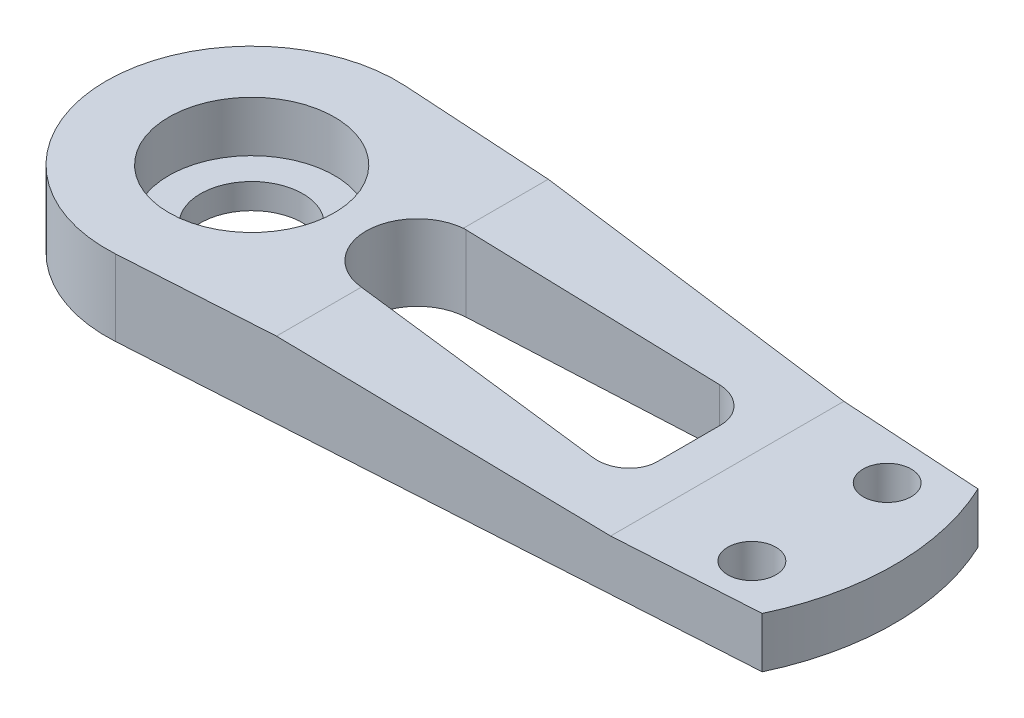
ISO-10303-21;
HEADER;
FILE_DESCRIPTION(('STEP AP214'),'2;1');
FILE_NAME('part.step','',(''),(''),'','','');
FILE_SCHEMA(('AUTOMOTIVE_DESIGN { 1 0 10303 214 1 1 1 1 }'));
ENDSEC;
DATA;
#1=APPLICATION_CONTEXT('core data for automotive mechanical design processes');
#2=APPLICATION_PROTOCOL_DEFINITION('international standard','automotive_design',2000,#1);
#3=PRODUCT_CONTEXT('',#1,'mechanical');
#4=PRODUCT('Part','Part','',(#3));
#5=PRODUCT_RELATED_PRODUCT_CATEGORY('part','',(#4));
#6=PRODUCT_DEFINITION_FORMATION('','',#4);
#7=PRODUCT_DEFINITION_CONTEXT('part definition',#1,'design');
#8=PRODUCT_DEFINITION('design','',#6,#7);
#9=PRODUCT_DEFINITION_SHAPE('','',#8);
#10=(LENGTH_UNIT() NAMED_UNIT(*) SI_UNIT(.MILLI.,.METRE.));
#11=(NAMED_UNIT(*) PLANE_ANGLE_UNIT() SI_UNIT($,.RADIAN.));
#12=(NAMED_UNIT(*) SI_UNIT($,.STERADIAN.) SOLID_ANGLE_UNIT());
#13=UNCERTAINTY_MEASURE_WITH_UNIT(LENGTH_MEASURE(1.E-05),#10,'distance_accuracy_value','');
#14=(GEOMETRIC_REPRESENTATION_CONTEXT(3) GLOBAL_UNCERTAINTY_ASSIGNED_CONTEXT((#13)) GLOBAL_UNIT_ASSIGNED_CONTEXT((#10,
#11,#12)) REPRESENTATION_CONTEXT('',''));
#15=CARTESIAN_POINT('',(0.,0.,0.));
#16=DIRECTION('',(0.,0.,1.));
#17=DIRECTION('',(1.,0.,0.));
#18=AXIS2_PLACEMENT_3D('',#15,#16,#17);
#19=CARTESIAN_POINT('',(0.702058204650816,6.,11.4785501818515));
#20=DIRECTION('',(-0.0610485395348535,0.,-0.998134798421867));
#21=DIRECTION('',(-0.998134798421867,0.,0.0610485395348535));
#22=AXIS2_PLACEMENT_3D('',#19,#20,#21);
#23=PLANE('',#22);
#24=DIRECTION('',(0.994941281323273,-0.0799295493697137,-0.0608532156616081));
#25=VECTOR('',#24,1.);
#26=CARTESIAN_POINT('',(0.778760734044066,6.95834388975943,11.4738588541816));
#27=LINE('',#26,#25);
#28=CARTESIAN_POINT('',(12.7079647035946,6.,10.7442374830944));
#29=VERTEX_POINT('',#28);
#30=CARTESIAN_POINT('',(37.6034204935723,4.,9.2215661771389));
#31=VERTEX_POINT('',#30);
#32=EDGE_CURVE('E285',#29,#31,#27,.T.);
#33=ORIENTED_EDGE('',*,*,#32,.F.);
#34=DIRECTION('',(0.998134798421867,0.,-0.0610485395348535));
#35=VECTOR('',#34,1.);
#36=CARTESIAN_POINT('',(0.702058204650816,6.,11.4785501818515));
#37=LINE('',#36,#35);
#38=CARTESIAN_POINT('',(0.702058204650816,6.,11.4785501818515));
#39=VERTEX_POINT('',#38);
#40=EDGE_CURVE('E115',#39,#29,#37,.T.);
#41=ORIENTED_EDGE('',*,*,#40,.F.);
#42=DIRECTION('',(0.,-1.,0.));
#43=VECTOR('',#42,1.);
#44=CARTESIAN_POINT('',(0.702058204650816,6.,11.4785501818515));
#45=LINE('',#44,#43);
#46=CARTESIAN_POINT('',(0.702058204650816,0.,11.4785501818515));
#47=VERTEX_POINT('',#46);
#48=EDGE_CURVE('E100',#39,#47,#45,.T.);
#49=ORIENTED_EDGE('',*,*,#48,.T.);
#50=DIRECTION('',(0.998134798421867,0.,-0.0610485395348535));
#51=VECTOR('',#50,1.);
#52=CARTESIAN_POINT('',(0.702058204650816,0.,11.4785501818515));
#53=LINE('',#52,#51);
#54=CARTESIAN_POINT('',(48.9,0.,8.53063777578755));
#55=VERTEX_POINT('',#54);
#56=EDGE_CURVE('E114',#47,#55,#53,.T.);
#57=ORIENTED_EDGE('',*,*,#56,.T.);
#58=DIRECTION('',(0.,-1.,0.));
#59=VECTOR('',#58,1.);
#60=CARTESIAN_POINT('',(48.9,6.,8.53063777578755));
#61=LINE('',#60,#59);
#62=CARTESIAN_POINT('',(48.9,4.,8.53063777578755));
#63=VERTEX_POINT('',#62);
#64=EDGE_CURVE('E134',#63,#55,#61,.T.);
#65=ORIENTED_EDGE('',*,*,#64,.F.);
#66=DIRECTION('',(0.998134798421867,0.,-0.0610485395348535));
#67=VECTOR('',#66,1.);
#68=CARTESIAN_POINT('',(0.702058204650816,3.99999999999999,11.4785501818515));
#69=LINE('',#68,#67);
#70=EDGE_CURVE('E231',#31,#63,#69,.T.);
#71=ORIENTED_EDGE('',*,*,#70,.F.);
#72=EDGE_LOOP('',(#33,#41,#49,#57,#65,#71));
#73=FACE_BOUND('',#72,.T.);
#74=ADVANCED_FACE('F35',(#73),#23,.F.);
#75=CARTESIAN_POINT('',(30.8105495070108,6.,0.));
#76=DIRECTION('',(0.,-1.,0.));
#77=DIRECTION('',(0.,0.,-1.));
#78=AXIS2_PLACEMENT_3D('',#75,#76,#77);
#79=CYLINDRICAL_SURFACE('',#78,20.);
#80=CARTESIAN_POINT('',(30.8105495070108,4.,0.));
#81=DIRECTION('',(0.,1.,0.));
#82=DIRECTION('',(-1.,0.,0.));
#83=AXIS2_PLACEMENT_3D('',#80,#81,#82);
#84=CIRCLE('',#83,20.);
#85=CARTESIAN_POINT('',(48.9,4.,-8.53063777578755));
#86=VERTEX_POINT('',#85);
#87=EDGE_CURVE('E235',#63,#86,#84,.T.);
#88=ORIENTED_EDGE('',*,*,#87,.F.);
#89=ORIENTED_EDGE('',*,*,#64,.T.);
#90=CARTESIAN_POINT('',(30.8105495070108,0.,0.));
#91=DIRECTION('',(0.,1.,0.));
#92=DIRECTION('',(0.,0.,1.));
#93=AXIS2_PLACEMENT_3D('',#90,#91,#92);
#94=CIRCLE('',#93,20.);
#95=CARTESIAN_POINT('',(48.9,0.,-8.53063777578755));
#96=VERTEX_POINT('',#95);
#97=EDGE_CURVE('E121',#55,#96,#94,.T.);
#98=ORIENTED_EDGE('',*,*,#97,.T.);
#99=DIRECTION('',(0.,-1.,0.));
#100=VECTOR('',#99,1.);
#101=CARTESIAN_POINT('',(48.9,6.,-8.53063777578755));
#102=LINE('',#101,#100);
#103=EDGE_CURVE('E132',#86,#96,#102,.T.);
#104=ORIENTED_EDGE('',*,*,#103,.F.);
#105=EDGE_LOOP('',(#88,#89,#98,#104));
#106=FACE_BOUND('',#105,.T.);
#107=ADVANCED_FACE('F242',(#106),#79,.T.);
#108=CARTESIAN_POINT('',(0.702058204650816,6.,-11.4785501818515));
#109=DIRECTION('',(0.0610485395348535,0.,-0.998134798421867));
#110=DIRECTION('',(-0.998134798421867,0.,-0.0610485395348535));
#111=AXIS2_PLACEMENT_3D('',#108,#109,#110);
#112=PLANE('',#111);
#113=DIRECTION('',(0.998134798421867,0.,0.0610485395348535));
#114=VECTOR('',#113,1.);
#115=CARTESIAN_POINT('',(0.702058204650816,6.,-11.4785501818515));
#116=LINE('',#115,#114);
#117=CARTESIAN_POINT('',(0.702058204650816,6.,-11.4785501818515));
#118=VERTEX_POINT('',#117);
#119=CARTESIAN_POINT('',(12.7079647035946,6.,-10.7442374830944));
#120=VERTEX_POINT('',#119);
#121=EDGE_CURVE('E154',#118,#120,#116,.T.);
#122=ORIENTED_EDGE('',*,*,#121,.T.);
#123=DIRECTION('',(0.994941281323273,-0.0799295493697137,0.0608532156616081));
#124=VECTOR('',#123,1.);
#125=CARTESIAN_POINT('',(0.778760734044066,6.95834388975943,-11.4738588541816));
#126=LINE('',#125,#124);
#127=CARTESIAN_POINT('',(37.6034204935723,4.,-9.2215661771389));
#128=VERTEX_POINT('',#127);
#129=EDGE_CURVE('E51',#120,#128,#126,.T.);
#130=ORIENTED_EDGE('',*,*,#129,.T.);
#131=DIRECTION('',(0.998134798421867,0.,0.0610485395348535));
#132=VECTOR('',#131,1.);
#133=CARTESIAN_POINT('',(0.702058204650816,3.99999999999999,-11.4785501818515));
#134=LINE('',#133,#132);
#135=EDGE_CURVE('E243',#128,#86,#134,.T.);
#136=ORIENTED_EDGE('',*,*,#135,.T.);
#137=ORIENTED_EDGE('',*,*,#103,.T.);
#138=DIRECTION('',(0.998134798421867,0.,0.0610485395348535));
#139=VECTOR('',#138,1.);
#140=CARTESIAN_POINT('',(0.702058204650816,0.,-11.4785501818515));
#141=LINE('',#140,#139);
#142=CARTESIAN_POINT('',(0.702058204650816,0.,-11.4785501818515));
#143=VERTEX_POINT('',#142);
#144=EDGE_CURVE('E108',#143,#96,#141,.T.);
#145=ORIENTED_EDGE('',*,*,#144,.F.);
#146=DIRECTION('',(0.,-1.,0.));
#147=VECTOR('',#146,1.);
#148=CARTESIAN_POINT('',(0.702058204650816,6.,-11.4785501818515));
#149=LINE('',#148,#147);
#150=EDGE_CURVE('E102',#118,#143,#149,.T.);
#151=ORIENTED_EDGE('',*,*,#150,.F.);
#152=EDGE_LOOP('',(#122,#130,#136,#137,#145,#151));
#153=FACE_BOUND('',#152,.T.);
#154=ADVANCED_FACE('F160',(#153),#112,.T.);
#155=CARTESIAN_POINT('',(13.1,6.,0.));
#156=DIRECTION('',(0.,-1.,0.));
#157=DIRECTION('',(0.,0.,-1.));
#158=AXIS2_PLACEMENT_3D('',#155,#156,#157);
#159=CYLINDRICAL_SURFACE('',#158,4.05);
#160=DIRECTION('',(0.,-1.,0.));
#161=VECTOR('',#160,1.);
#162=CARTESIAN_POINT('',(12.8981621805094,6.,-4.04496742812884));
#163=LINE('',#162,#161);
#164=CARTESIAN_POINT('',(12.8981621805094,5.98472030570404,-4.04496742812884));
#165=VERTEX_POINT('',#164);
#166=CARTESIAN_POINT('',(12.8981621805094,0.,-4.04496742812884));
#167=VERTEX_POINT('',#166);
#168=EDGE_CURVE('E116',#165,#167,#163,.T.);
#169=ORIENTED_EDGE('',*,*,#168,.F.);
#170=CARTESIAN_POINT('',(13.1,5.96850547347173,0.));
#171=DIRECTION('',(0.080077955782428,0.996788603966612,0.));
#172=DIRECTION('',(0.996788603966612,-0.080077955782428,0.));
#173=AXIS2_PLACEMENT_3D('',#170,#171,#172);
#174=ELLIPSE('',#173,4.06304805641182,4.05);
#175=CARTESIAN_POINT('',(12.7079647035946,6.,-4.0309810625172));
#176=VERTEX_POINT('',#175);
#177=EDGE_CURVE('E260',#165,#176,#174,.T.);
#178=ORIENTED_EDGE('',*,*,#177,.T.);
#179=CARTESIAN_POINT('',(13.1,6.,0.));
#180=DIRECTION('',(0.,1.,0.));
#181=DIRECTION('',(0.,0.,1.));
#182=AXIS2_PLACEMENT_3D('',#179,#180,#181);
#183=CIRCLE('',#182,4.05);
#184=CARTESIAN_POINT('',(12.7079647035946,6.,4.0309810625172));
#185=VERTEX_POINT('',#184);
#186=EDGE_CURVE('E107',#176,#185,#183,.T.);
#187=ORIENTED_EDGE('',*,*,#186,.T.);
#188=CARTESIAN_POINT('',(12.8981621805094,5.98472030570404,4.04496742812884));
#189=VERTEX_POINT('',#188);
#190=EDGE_CURVE('E258',#185,#189,#174,.T.);
#191=ORIENTED_EDGE('',*,*,#190,.T.);
#192=DIRECTION('',(0.,-1.,0.));
#193=VECTOR('',#192,1.);
#194=CARTESIAN_POINT('',(12.8981621805094,6.,4.04496742812884));
#195=LINE('',#194,#193);
#196=CARTESIAN_POINT('',(12.8981621805094,0.,4.04496742812884));
#197=VERTEX_POINT('',#196);
#198=EDGE_CURVE('E136',#189,#197,#195,.T.);
#199=ORIENTED_EDGE('',*,*,#198,.T.);
#200=CARTESIAN_POINT('',(13.1,0.,0.));
#201=DIRECTION('',(0.,1.,0.));
#202=DIRECTION('',(0.,0.,1.));
#203=AXIS2_PLACEMENT_3D('',#200,#201,#202);
#204=CIRCLE('',#203,4.05);
#205=EDGE_CURVE('E176',#167,#197,#204,.T.);
#206=ORIENTED_EDGE('',*,*,#205,.F.);
#207=EDGE_LOOP('',(#169,#178,#187,#191,#199,#206));
#208=FACE_BOUND('',#207,.T.);
#209=ADVANCED_FACE('F256',(#208),#159,.F.);
#210=CARTESIAN_POINT('',(-0.169301656074376,6.,-3.39292054421391));
#211=DIRECTION('',(-0.0498364986396635,0.,-0.998757389661442));
#212=DIRECTION('',(-0.998757389661443,0.,0.0498364986396635));
#213=AXIS2_PLACEMENT_3D('',#210,#211,#212);
#214=PLANE('',#213);
#215=DIRECTION('',(0.995557912062035,-0.0799790869836433,-0.0496768494969578));
#216=VECTOR('',#215,1.);
#217=CARTESIAN_POINT('',(-0.0869302341376886,7.02788999291053,-3.39703075486145));
#218=LINE('',#217,#216);
#219=CARTESIAN_POINT('',(31.9754087534008,4.45213164905678,-4.99689347415361));
#220=VERTEX_POINT('',#219);
#221=EDGE_CURVE('E281',#165,#220,#218,.T.);
#222=ORIENTED_EDGE('',*,*,#221,.F.);
#223=ORIENTED_EDGE('',*,*,#168,.T.);
#224=DIRECTION('',(0.998757389661443,0.,-0.0498364986396635));
#225=VECTOR('',#224,1.);
#226=CARTESIAN_POINT('',(-0.169301656074376,0.,-3.39292054421391));
#227=LINE('',#226,#225);
#228=CARTESIAN_POINT('',(31.9754087534008,0.,-4.99689347415361));
#229=VERTEX_POINT('',#228);
#230=EDGE_CURVE('E179',#167,#229,#227,.T.);
#231=ORIENTED_EDGE('',*,*,#230,.T.);
#232=DIRECTION('',(0.,-1.,0.));
#233=VECTOR('',#232,1.);
#234=CARTESIAN_POINT('',(31.9754087534008,6.,-4.99689347415361));
#235=LINE('',#234,#233);
#236=EDGE_CURVE('E144',#220,#229,#235,.T.);
#237=ORIENTED_EDGE('',*,*,#236,.F.);
#238=EDGE_LOOP('',(#222,#223,#231,#237));
#239=FACE_BOUND('',#238,.T.);
#240=ADVANCED_FACE('F323',(#239),#214,.F.);
#241=CARTESIAN_POINT('',(32.1,6.,-2.5));
#242=DIRECTION('',(0.,-1.,0.));
#243=DIRECTION('',(0.,0.,-1.));
#244=AXIS2_PLACEMENT_3D('',#241,#242,#243);
#245=CYLINDRICAL_SURFACE('',#244,2.5);
#246=DIRECTION('',(0.,-1.,0.));
#247=VECTOR('',#246,1.);
#248=CARTESIAN_POINT('',(34.6,6.,-2.5));
#249=LINE('',#248,#247);
#250=CARTESIAN_POINT('',(34.6,4.24128262755337,-2.5));
#251=VERTEX_POINT('',#250);
#252=CARTESIAN_POINT('',(34.6,0.,-2.5));
#253=VERTEX_POINT('',#252);
#254=EDGE_CURVE('E142',#251,#253,#249,.T.);
#255=ORIENTED_EDGE('',*,*,#254,.F.);
#256=CARTESIAN_POINT('',(32.1,4.44212249335783,-2.5));
#257=DIRECTION('',(0.080077955782428,0.996788603966612,0.));
#258=DIRECTION('',(0.996788603966612,-0.080077955782428,0.));
#259=AXIS2_PLACEMENT_3D('',#256,#257,#258);
#260=ELLIPSE('',#259,2.50805435580977,2.5);
#261=EDGE_CURVE('E214',#251,#220,#260,.T.);
#262=ORIENTED_EDGE('',*,*,#261,.T.);
#263=ORIENTED_EDGE('',*,*,#236,.T.);
#264=CARTESIAN_POINT('',(32.1,0.,-2.5));
#265=DIRECTION('',(0.,1.,0.));
#266=DIRECTION('',(0.,0.,1.));
#267=AXIS2_PLACEMENT_3D('',#264,#265,#266);
#268=CIRCLE('',#267,2.5);
#269=EDGE_CURVE('E182',#253,#229,#268,.T.);
#270=ORIENTED_EDGE('',*,*,#269,.F.);
#271=EDGE_LOOP('',(#255,#262,#263,#270));
#272=FACE_BOUND('',#271,.T.);
#273=ADVANCED_FACE('F211',(#272),#245,.F.);
#274=CARTESIAN_POINT('',(34.6,6.,0.));
#275=DIRECTION('',(1.,0.,0.));
#276=DIRECTION('',(0.,0.,-1.));
#277=AXIS2_PLACEMENT_3D('',#274,#275,#276);
#278=PLANE('',#277);
#279=DIRECTION('',(0.,0.,1.));
#280=VECTOR('',#279,1.);
#281=CARTESIAN_POINT('',(34.6,4.24128262755337,0.));
#282=LINE('',#281,#280);
#283=CARTESIAN_POINT('',(34.6,4.24128262755337,2.5));
#284=VERTEX_POINT('',#283);
#285=EDGE_CURVE('E208',#251,#284,#282,.T.);
#286=ORIENTED_EDGE('',*,*,#285,.F.);
#287=ORIENTED_EDGE('',*,*,#254,.T.);
#288=DIRECTION('',(0.,0.,1.));
#289=VECTOR('',#288,1.);
#290=CARTESIAN_POINT('',(34.6,0.,0.));
#291=LINE('',#290,#289);
#292=CARTESIAN_POINT('',(34.6,0.,2.5));
#293=VERTEX_POINT('',#292);
#294=EDGE_CURVE('E185',#253,#293,#291,.T.);
#295=ORIENTED_EDGE('',*,*,#294,.T.);
#296=DIRECTION('',(0.,-1.,0.));
#297=VECTOR('',#296,1.);
#298=CARTESIAN_POINT('',(34.6,6.,2.5));
#299=LINE('',#298,#297);
#300=EDGE_CURVE('E140',#284,#293,#299,.T.);
#301=ORIENTED_EDGE('',*,*,#300,.F.);
#302=EDGE_LOOP('',(#286,#287,#295,#301));
#303=FACE_BOUND('',#302,.T.);
#304=ADVANCED_FACE('F204',(#303),#278,.F.);
#305=CARTESIAN_POINT('',(32.1,6.,2.5));
#306=DIRECTION('',(0.,-1.,0.));
#307=DIRECTION('',(0.,0.,-1.));
#308=AXIS2_PLACEMENT_3D('',#305,#306,#307);
#309=CYLINDRICAL_SURFACE('',#308,2.5);
#310=DIRECTION('',(0.,-1.,0.));
#311=VECTOR('',#310,1.);
#312=CARTESIAN_POINT('',(31.9754087534008,6.,4.99689347415361));
#313=LINE('',#312,#311);
#314=CARTESIAN_POINT('',(31.9754087534008,4.45213164905678,4.99689347415361));
#315=VERTEX_POINT('',#314);
#316=CARTESIAN_POINT('',(31.9754087534008,0.,4.99689347415361));
#317=VERTEX_POINT('',#316);
#318=EDGE_CURVE('E138',#315,#317,#313,.T.);
#319=ORIENTED_EDGE('',*,*,#318,.F.);
#320=CARTESIAN_POINT('',(32.1,4.44212249335783,2.5));
#321=DIRECTION('',(0.080077955782428,0.996788603966612,0.));
#322=DIRECTION('',(0.996788603966612,-0.080077955782428,0.));
#323=AXIS2_PLACEMENT_3D('',#320,#321,#322);
#324=ELLIPSE('',#323,2.50805435580977,2.5);
#325=EDGE_CURVE('E201',#315,#284,#324,.T.);
#326=ORIENTED_EDGE('',*,*,#325,.T.);
#327=ORIENTED_EDGE('',*,*,#300,.T.);
#328=CARTESIAN_POINT('',(32.1,0.,2.5));
#329=DIRECTION('',(0.,1.,0.));
#330=DIRECTION('',(0.,0.,1.));
#331=AXIS2_PLACEMENT_3D('',#328,#329,#330);
#332=CIRCLE('',#331,2.5);
#333=EDGE_CURVE('E126',#317,#293,#332,.T.);
#334=ORIENTED_EDGE('',*,*,#333,.F.);
#335=EDGE_LOOP('',(#319,#326,#327,#334));
#336=FACE_BOUND('',#335,.T.);
#337=ADVANCED_FACE('F195',(#336),#309,.F.);
#338=CARTESIAN_POINT('',(-0.169301656074376,6.,3.39292054421391));
#339=DIRECTION('',(-0.0498364986396635,0.,0.998757389661442));
#340=DIRECTION('',(0.998757389661443,0.,0.0498364986396635));
#341=AXIS2_PLACEMENT_3D('',#338,#339,#340);
#342=PLANE('',#341);
#343=DIRECTION('',(-0.995557912062035,0.0799790869836433,-0.0496768494969577));
#344=VECTOR('',#343,1.);
#345=CARTESIAN_POINT('',(-0.0869302341376885,7.02788999291053,3.39703075486145));
#346=LINE('',#345,#344);
#347=EDGE_CURVE('E272',#315,#189,#346,.T.);
#348=ORIENTED_EDGE('',*,*,#347,.F.);
#349=ORIENTED_EDGE('',*,*,#318,.T.);
#350=DIRECTION('',(-0.998757389661443,0.,-0.0498364986396635));
#351=VECTOR('',#350,1.);
#352=CARTESIAN_POINT('',(-0.169301656074376,0.,3.39292054421391));
#353=LINE('',#352,#351);
#354=EDGE_CURVE('E122',#317,#197,#353,.T.);
#355=ORIENTED_EDGE('',*,*,#354,.T.);
#356=ORIENTED_EDGE('',*,*,#198,.F.);
#357=EDGE_LOOP('',(#348,#349,#355,#356));
#358=FACE_BOUND('',#357,.T.);
#359=ADVANCED_FACE('F313',(#358),#342,.F.);
#360=CARTESIAN_POINT('',(44.9,6.,-5.35));
#361=DIRECTION('',(0.,-1.,0.));
#362=DIRECTION('',(0.,0.,-1.));
#363=AXIS2_PLACEMENT_3D('',#360,#361,#362);
#364=CYLINDRICAL_SURFACE('',#363,1.9);
#365=CARTESIAN_POINT('',(44.9,0.,-5.35));
#366=DIRECTION('',(0.,1.,0.));
#367=DIRECTION('',(0.,0.,1.));
#368=AXIS2_PLACEMENT_3D('',#365,#366,#367);
#369=CIRCLE('',#368,1.9);
#370=CARTESIAN_POINT('',(44.9,0.,-3.45));
#371=VERTEX_POINT('',#370);
#372=EDGE_CURVE('E173',#371,#371,#369,.T.);
#373=ORIENTED_EDGE('',*,*,#372,.F.);
#374=EDGE_LOOP('',(#373));
#375=FACE_BOUND('',#374,.T.);
#376=CARTESIAN_POINT('',(44.9,4.,-5.35));
#377=DIRECTION('',(0.,1.,0.));
#378=DIRECTION('',(-1.,0.,0.));
#379=AXIS2_PLACEMENT_3D('',#376,#377,#378);
#380=CIRCLE('',#379,1.9);
#381=CARTESIAN_POINT('',(43.,4.,-5.35));
#382=VERTEX_POINT('',#381);
#383=EDGE_CURVE('E245',#382,#382,#380,.T.);
#384=ORIENTED_EDGE('',*,*,#383,.T.);
#385=EDGE_LOOP('',(#384));
#386=FACE_BOUND('',#385,.T.);
#387=ADVANCED_FACE('F316',(#375,#386),#364,.F.);
#388=CARTESIAN_POINT('',(44.9,6.,5.35));
#389=DIRECTION('',(0.,-1.,0.));
#390=DIRECTION('',(0.,0.,-1.));
#391=AXIS2_PLACEMENT_3D('',#388,#389,#390);
#392=CYLINDRICAL_SURFACE('',#391,1.9);
#393=CARTESIAN_POINT('',(44.9,0.,5.35));
#394=DIRECTION('',(0.,1.,0.));
#395=DIRECTION('',(0.,0.,1.));
#396=AXIS2_PLACEMENT_3D('',#393,#394,#395);
#397=CIRCLE('',#396,1.9);
#398=CARTESIAN_POINT('',(44.9,0.,7.25));
#399=VERTEX_POINT('',#398);
#400=EDGE_CURVE('E149',#399,#399,#397,.T.);
#401=ORIENTED_EDGE('',*,*,#400,.F.);
#402=EDGE_LOOP('',(#401));
#403=FACE_BOUND('',#402,.T.);
#404=CARTESIAN_POINT('',(44.9,4.,5.35));
#405=DIRECTION('',(0.,1.,0.));
#406=DIRECTION('',(-1.,0.,0.));
#407=AXIS2_PLACEMENT_3D('',#404,#405,#406);
#408=CIRCLE('',#407,1.9);
#409=CARTESIAN_POINT('',(43.,4.,5.35));
#410=VERTEX_POINT('',#409);
#411=EDGE_CURVE('E39',#410,#410,#408,.T.);
#412=ORIENTED_EDGE('',*,*,#411,.T.);
#413=EDGE_LOOP('',(#412));
#414=FACE_BOUND('',#413,.T.);
#415=ADVANCED_FACE('F37',(#403,#414),#392,.F.);
#416=CARTESIAN_POINT('',(0.,6.,0.));
#417=DIRECTION('',(0.,1.,0.));
#418=DIRECTION('',(0.,0.,1.));
#419=AXIS2_PLACEMENT_3D('',#416,#417,#418);
#420=PLANE('',#419);
#421=CARTESIAN_POINT('',(0.,6.,0.));
#422=DIRECTION('',(0.,1.,0.));
#423=DIRECTION('',(0.,0.,1.));
#424=AXIS2_PLACEMENT_3D('',#421,#422,#423);
#425=CIRCLE('',#424,6.55);
#426=CARTESIAN_POINT('',(0.,6.,6.55));
#427=VERTEX_POINT('',#426);
#428=EDGE_CURVE('E238',#427,#427,#425,.T.);
#429=ORIENTED_EDGE('',*,*,#428,.F.);
#430=EDGE_LOOP('',(#429));
#431=FACE_BOUND('',#430,.T.);
#432=ORIENTED_EDGE('',*,*,#40,.T.);
#433=DIRECTION('',(0.,0.,-1.));
#434=VECTOR('',#433,1.);
#435=CARTESIAN_POINT('',(12.7079647035946,6.,0.));
#436=LINE('',#435,#434);
#437=EDGE_CURVE('E11',#29,#185,#436,.T.);
#438=ORIENTED_EDGE('',*,*,#437,.T.);
#439=ORIENTED_EDGE('',*,*,#186,.F.);
#440=EDGE_CURVE('E44',#176,#120,#436,.T.);
#441=ORIENTED_EDGE('',*,*,#440,.T.);
#442=ORIENTED_EDGE('',*,*,#121,.F.);
#443=CARTESIAN_POINT('',(0.,6.,0.));
#444=DIRECTION('',(0.,1.,0.));
#445=DIRECTION('',(0.,0.,1.));
#446=AXIS2_PLACEMENT_3D('',#443,#444,#445);
#447=CIRCLE('',#446,11.5);
#448=EDGE_CURVE('E60',#118,#39,#447,.T.);
#449=ORIENTED_EDGE('',*,*,#448,.T.);
#450=EDGE_LOOP('',(#432,#438,#439,#441,#442,#449));
#451=FACE_BOUND('',#450,.T.);
#452=ADVANCED_FACE('F153',(#431,#451),#420,.T.);
#453=CARTESIAN_POINT('',(0.,6.,0.));
#454=DIRECTION('',(0.,-1.,0.));
#455=DIRECTION('',(0.,0.,-1.));
#456=AXIS2_PLACEMENT_3D('',#453,#454,#455);
#457=CYLINDRICAL_SURFACE('',#456,4.05);
#458=CARTESIAN_POINT('',(0.,0.,0.));
#459=DIRECTION('',(0.,1.,0.));
#460=DIRECTION('',(0.,0.,1.));
#461=AXIS2_PLACEMENT_3D('',#458,#459,#460);
#462=CIRCLE('',#461,4.05);
#463=CARTESIAN_POINT('',(0.,0.,4.05));
#464=VERTEX_POINT('',#463);
#465=EDGE_CURVE('E170',#464,#464,#462,.T.);
#466=ORIENTED_EDGE('',*,*,#465,.F.);
#467=EDGE_LOOP('',(#466));
#468=FACE_BOUND('',#467,.T.);
#469=CARTESIAN_POINT('',(0.,2.,0.));
#470=DIRECTION('',(0.,1.,0.));
#471=DIRECTION('',(0.,0.,1.));
#472=AXIS2_PLACEMENT_3D('',#469,#470,#471);
#473=CIRCLE('',#472,4.05);
#474=CARTESIAN_POINT('',(0.,2.,4.05));
#475=VERTEX_POINT('',#474);
#476=EDGE_CURVE('E147',#475,#475,#473,.T.);
#477=ORIENTED_EDGE('',*,*,#476,.T.);
#478=EDGE_LOOP('',(#477));
#479=FACE_BOUND('',#478,.T.);
#480=ADVANCED_FACE('F331',(#468,#479),#457,.F.);
#481=CARTESIAN_POINT('',(0.,6.,0.));
#482=DIRECTION('',(0.,-1.,0.));
#483=DIRECTION('',(0.,0.,-1.));
#484=AXIS2_PLACEMENT_3D('',#481,#482,#483);
#485=CYLINDRICAL_SURFACE('',#484,11.5);
#486=CARTESIAN_POINT('',(0.,0.,0.));
#487=DIRECTION('',(0.,1.,0.));
#488=DIRECTION('',(0.,0.,1.));
#489=AXIS2_PLACEMENT_3D('',#486,#487,#488);
#490=CIRCLE('',#489,11.5);
#491=EDGE_CURVE('E97',#143,#47,#490,.T.);
#492=ORIENTED_EDGE('',*,*,#491,.T.);
#493=ORIENTED_EDGE('',*,*,#48,.F.);
#494=ORIENTED_EDGE('',*,*,#448,.F.);
#495=ORIENTED_EDGE('',*,*,#150,.T.);
#496=EDGE_LOOP('',(#492,#493,#494,#495));
#497=FACE_BOUND('',#496,.T.);
#498=ADVANCED_FACE('F99',(#497),#485,.T.);
#499=CARTESIAN_POINT('',(0.,0.,0.));
#500=DIRECTION('',(0.,1.,0.));
#501=DIRECTION('',(0.,0.,1.));
#502=AXIS2_PLACEMENT_3D('',#499,#500,#501);
#503=PLANE('',#502);
#504=ORIENTED_EDGE('',*,*,#400,.T.);
#505=EDGE_LOOP('',(#504));
#506=FACE_BOUND('',#505,.T.);
#507=ORIENTED_EDGE('',*,*,#465,.T.);
#508=EDGE_LOOP('',(#507));
#509=FACE_BOUND('',#508,.T.);
#510=ORIENTED_EDGE('',*,*,#372,.T.);
#511=EDGE_LOOP('',(#510));
#512=FACE_BOUND('',#511,.T.);
#513=ORIENTED_EDGE('',*,*,#205,.T.);
#514=ORIENTED_EDGE('',*,*,#354,.F.);
#515=ORIENTED_EDGE('',*,*,#333,.T.);
#516=ORIENTED_EDGE('',*,*,#294,.F.);
#517=ORIENTED_EDGE('',*,*,#269,.T.);
#518=ORIENTED_EDGE('',*,*,#230,.F.);
#519=EDGE_LOOP('',(#513,#514,#515,#516,#517,#518));
#520=FACE_BOUND('',#519,.T.);
#521=ORIENTED_EDGE('',*,*,#56,.F.);
#522=ORIENTED_EDGE('',*,*,#491,.F.);
#523=ORIENTED_EDGE('',*,*,#144,.T.);
#524=ORIENTED_EDGE('',*,*,#97,.F.);
#525=EDGE_LOOP('',(#521,#522,#523,#524));
#526=FACE_BOUND('',#525,.T.);
#527=ADVANCED_FACE('F119',(#506,#509,#512,#520,#526),#503,.F.);
#528=CARTESIAN_POINT('',(0.,2.,0.));
#529=DIRECTION('',(0.,1.,0.));
#530=DIRECTION('',(0.,0.,1.));
#531=AXIS2_PLACEMENT_3D('',#528,#529,#530);
#532=CYLINDRICAL_SURFACE('',#531,6.55);
#533=CARTESIAN_POINT('',(0.,2.,0.));
#534=DIRECTION('',(0.,1.,0.));
#535=DIRECTION('',(0.,0.,1.));
#536=AXIS2_PLACEMENT_3D('',#533,#534,#535);
#537=CIRCLE('',#536,6.55);
#538=CARTESIAN_POINT('',(0.,2.,6.55));
#539=VERTEX_POINT('',#538);
#540=EDGE_CURVE('E150',#539,#539,#537,.T.);
#541=ORIENTED_EDGE('',*,*,#540,.F.);
#542=EDGE_LOOP('',(#541));
#543=FACE_BOUND('',#542,.T.);
#544=ORIENTED_EDGE('',*,*,#428,.T.);
#545=EDGE_LOOP('',(#544));
#546=FACE_BOUND('',#545,.T.);
#547=ADVANCED_FACE('F302',(#543,#546),#532,.F.);
#548=CARTESIAN_POINT('',(0.,2.,0.));
#549=DIRECTION('',(0.,1.,0.));
#550=DIRECTION('',(0.,0.,1.));
#551=AXIS2_PLACEMENT_3D('',#548,#549,#550);
#552=PLANE('',#551);
#553=ORIENTED_EDGE('',*,*,#476,.F.);
#554=EDGE_LOOP('',(#553));
#555=FACE_BOUND('',#554,.T.);
#556=ORIENTED_EDGE('',*,*,#540,.T.);
#557=EDGE_LOOP('',(#556));
#558=FACE_BOUND('',#557,.T.);
#559=ADVANCED_FACE('F294',(#555,#558),#552,.T.);
#560=CARTESIAN_POINT('',(50.8105495070108,4.,21.));
#561=DIRECTION('',(0.,1.,0.));
#562=DIRECTION('',(-1.,0.,0.));
#563=AXIS2_PLACEMENT_3D('',#560,#561,#562);
#564=PLANE('',#563);
#565=ORIENTED_EDGE('',*,*,#383,.F.);
#566=EDGE_LOOP('',(#565));
#567=FACE_BOUND('',#566,.T.);
#568=ORIENTED_EDGE('',*,*,#411,.F.);
#569=EDGE_LOOP('',(#568));
#570=FACE_BOUND('',#569,.T.);
#571=ORIENTED_EDGE('',*,*,#70,.T.);
#572=ORIENTED_EDGE('',*,*,#87,.T.);
#573=ORIENTED_EDGE('',*,*,#135,.F.);
#574=DIRECTION('',(0.,0.,-1.));
#575=VECTOR('',#574,1.);
#576=CARTESIAN_POINT('',(37.6034204935723,4.,21.));
#577=LINE('',#576,#575);
#578=EDGE_CURVE('E237',#31,#128,#577,.T.);
#579=ORIENTED_EDGE('',*,*,#578,.F.);
#580=EDGE_LOOP('',(#571,#572,#573,#579));
#581=FACE_BOUND('',#580,.T.);
#582=ADVANCED_FACE('F233',(#567,#570,#581),#564,.T.);
#583=CARTESIAN_POINT('',(37.6034204935723,4.,21.));
#584=DIRECTION('',(0.080077955782428,0.996788603966612,0.));
#585=DIRECTION('',(-0.996788603966612,0.080077955782428,0.));
#586=AXIS2_PLACEMENT_3D('',#583,#584,#585);
#587=PLANE('',#586);
#588=ORIENTED_EDGE('',*,*,#32,.T.);
#589=ORIENTED_EDGE('',*,*,#578,.T.);
#590=ORIENTED_EDGE('',*,*,#129,.F.);
#591=ORIENTED_EDGE('',*,*,#440,.F.);
#592=ORIENTED_EDGE('',*,*,#177,.F.);
#593=ORIENTED_EDGE('',*,*,#221,.T.);
#594=ORIENTED_EDGE('',*,*,#261,.F.);
#595=ORIENTED_EDGE('',*,*,#285,.T.);
#596=ORIENTED_EDGE('',*,*,#325,.F.);
#597=ORIENTED_EDGE('',*,*,#347,.T.);
#598=ORIENTED_EDGE('',*,*,#190,.F.);
#599=ORIENTED_EDGE('',*,*,#437,.F.);
#600=EDGE_LOOP('',(#588,#589,#590,#591,#592,#593,#594,#595,#596,#597,#598,#599));
#601=FACE_BOUND('',#600,.T.);
#602=ADVANCED_FACE('F273',(#601),#587,.T.);
#603=CLOSED_SHELL('',(#74,#107,#154,#209,#240,#273,#304,#337,#359,#387,#415,#452,#480,#498,#527,
#547,#559,#582,#602));
#604=MANIFOLD_SOLID_BREP('B2',#603);
#605=ADVANCED_BREP_SHAPE_REPRESENTATION('',(#18,#604),#14);
#606=SHAPE_DEFINITION_REPRESENTATION(#9,#605);
ENDSEC;
END-ISO-10303-21;
